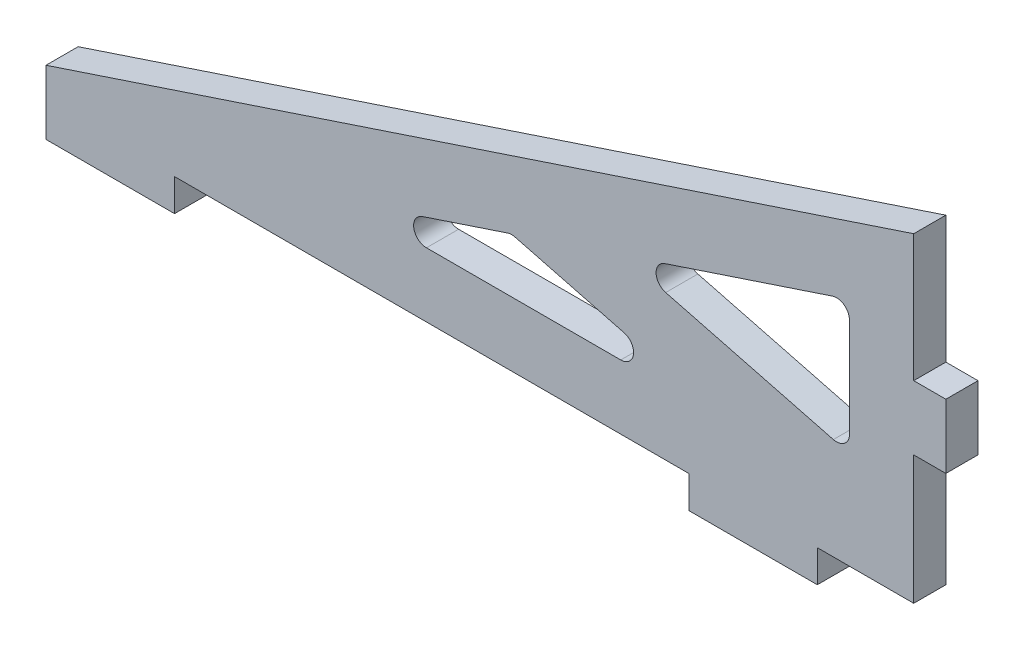
ISO-10303-21;
HEADER;
FILE_DESCRIPTION(('STEP AP214'),'2;1');
FILE_NAME('part.step','',(''),(''),'','','');
FILE_SCHEMA(('AUTOMOTIVE_DESIGN { 1 0 10303 214 1 1 1 1 }'));
ENDSEC;
DATA;
#1=APPLICATION_CONTEXT('core data for automotive mechanical design processes');
#2=APPLICATION_PROTOCOL_DEFINITION('international standard','automotive_design',2000,#1);
#3=PRODUCT_CONTEXT('',#1,'mechanical');
#4=PRODUCT('Part','Part','',(#3));
#5=PRODUCT_RELATED_PRODUCT_CATEGORY('part','',(#4));
#6=PRODUCT_DEFINITION_FORMATION('','',#4);
#7=PRODUCT_DEFINITION_CONTEXT('part definition',#1,'design');
#8=PRODUCT_DEFINITION('design','',#6,#7);
#9=PRODUCT_DEFINITION_SHAPE('','',#8);
#10=(LENGTH_UNIT() NAMED_UNIT(*) SI_UNIT(.MILLI.,.METRE.));
#11=(NAMED_UNIT(*) PLANE_ANGLE_UNIT() SI_UNIT($,.RADIAN.));
#12=(NAMED_UNIT(*) SI_UNIT($,.STERADIAN.) SOLID_ANGLE_UNIT());
#13=UNCERTAINTY_MEASURE_WITH_UNIT(LENGTH_MEASURE(1.E-05),#10,'distance_accuracy_value','');
#14=(GEOMETRIC_REPRESENTATION_CONTEXT(3) GLOBAL_UNCERTAINTY_ASSIGNED_CONTEXT((#13)) GLOBAL_UNIT_ASSIGNED_CONTEXT((#10,
#11,#12)) REPRESENTATION_CONTEXT('',''));
#15=CARTESIAN_POINT('',(0.,0.,0.));
#16=DIRECTION('',(0.,0.,1.));
#17=DIRECTION('',(1.,0.,0.));
#18=AXIS2_PLACEMENT_3D('',#15,#16,#17);
#19=CARTESIAN_POINT('',(0.,0.,6.35));
#20=DIRECTION('',(0.,0.,-1.));
#21=DIRECTION('',(-1.,0.,0.));
#22=AXIS2_PLACEMENT_3D('',#19,#20,#21);
#23=PLANE('',#22);
#24=DIRECTION('',(-0.967951190363356,0.251138394265319,0.));
#25=VECTOR('',#24,1.);
#26=CARTESIAN_POINT('',(40.1510767436975,154.752452894055,6.35));
#27=LINE('',#26,#25);
#28=CARTESIAN_POINT('',(21.2492621559513,159.656596214015,6.35));
#29=VERTEX_POINT('',#28);
#30=CARTESIAN_POINT('',(-0.29343059760243,165.245924808412,6.35));
#31=VERTEX_POINT('',#30);
#32=EDGE_CURVE('E360',#29,#31,#27,.T.);
#33=ORIENTED_EDGE('',*,*,#32,.F.);
#34=CARTESIAN_POINT('',(20.6113706345174,157.198000190492,6.35));
#35=DIRECTION('',(0.,0.,-1.));
#36=DIRECTION('',(-1.,0.,0.));
#37=AXIS2_PLACEMENT_3D('',#34,#35,#36);
#38=CIRCLE('',#37,2.54);
#39=CARTESIAN_POINT('',(20.6113706345174,154.658000190492,6.35));
#40=VERTEX_POINT('',#39);
#41=EDGE_CURVE('E305',#29,#40,#38,.T.);
#42=ORIENTED_EDGE('',*,*,#41,.T.);
#43=DIRECTION('',(-1.,0.,0.));
#44=VECTOR('',#43,1.);
#45=CARTESIAN_POINT('',(0.,154.658000190492,6.35));
#46=LINE('',#45,#44);
#47=CARTESIAN_POINT('',(-17.7741649816168,154.658000190492,6.35));
#48=VERTEX_POINT('',#47);
#49=EDGE_CURVE('E341',#40,#48,#46,.T.);
#50=ORIENTED_EDGE('',*,*,#49,.T.);
#51=CARTESIAN_POINT('',(-17.7741649816168,157.198000190492,6.35));
#52=DIRECTION('',(0.,0.,-1.));
#53=DIRECTION('',(-1.,0.,0.));
#54=AXIS2_PLACEMENT_3D('',#51,#52,#53);
#55=CIRCLE('',#54,2.54);
#56=CARTESIAN_POINT('',(-18.5741684928714,159.608725056996,6.35));
#57=VERTEX_POINT('',#56);
#58=EDGE_CURVE('E309',#48,#57,#55,.T.);
#59=ORIENTED_EDGE('',*,*,#58,.T.);
#60=DIRECTION('',(0.949104278151143,0.314962012304972,0.));
#61=VECTOR('',#60,1.);
#62=CARTESIAN_POINT('',(-49.5546997869046,149.327778375717,6.35));
#63=LINE('',#62,#61);
#64=CARTESIAN_POINT('',(-1.73132563029093,165.198053651393,6.35));
#65=VERTEX_POINT('',#64);
#66=EDGE_CURVE('E352',#57,#65,#63,.T.);
#67=ORIENTED_EDGE('',*,*,#66,.T.);
#68=CARTESIAN_POINT('',(-0.931322119036321,162.787328784889,6.35));
#69=DIRECTION('',(0.,0.,-1.));
#70=DIRECTION('',(-1.,0.,0.));
#71=AXIS2_PLACEMENT_3D('',#68,#69,#70);
#72=CIRCLE('',#71,2.54);
#73=EDGE_CURVE('E301',#65,#31,#72,.T.);
#74=ORIENTED_EDGE('',*,*,#73,.T.);
#75=EDGE_LOOP('',(#33,#42,#50,#59,#67,#74));
#76=FACE_BOUND('',#75,.T.);
#77=DIRECTION('',(0.,1.,0.));
#78=VECTOR('',#77,1.);
#79=CARTESIAN_POINT('',(78.4999848912985,180.058000190492,6.35));
#80=LINE('',#79,#78);
#81=CARTESIAN_POINT('',(78.4999848912985,180.058000190492,6.35));
#82=VERTEX_POINT('',#81);
#83=CARTESIAN_POINT('',(78.4999848912985,205.204000190492,6.35));
#84=VERTEX_POINT('',#83);
#85=EDGE_CURVE('E245',#82,#84,#80,.T.);
#86=ORIENTED_EDGE('',*,*,#85,.T.);
#87=DIRECTION('',(-0.949104278151143,-0.314962012304972,0.));
#88=VECTOR('',#87,1.);
#89=CARTESIAN_POINT('',(-92.9500151087015,148.308000190492,6.35));
#90=LINE('',#89,#88);
#91=CARTESIAN_POINT('',(-92.9500151087015,148.308000190492,6.35));
#92=VERTEX_POINT('',#91);
#93=EDGE_CURVE('E233',#84,#92,#90,.T.);
#94=ORIENTED_EDGE('',*,*,#93,.T.);
#95=DIRECTION('',(0.,-1.,0.));
#96=VECTOR('',#95,1.);
#97=CARTESIAN_POINT('',(-92.9500151087015,141.958000190492,6.35));
#98=LINE('',#97,#96);
#99=CARTESIAN_POINT('',(-92.9500151087015,135.608000190492,6.35));
#100=VERTEX_POINT('',#99);
#101=EDGE_CURVE('E244',#92,#100,#98,.T.);
#102=ORIENTED_EDGE('',*,*,#101,.T.);
#103=DIRECTION('',(1.,0.,0.));
#104=VECTOR('',#103,1.);
#105=CARTESIAN_POINT('',(-92.9500151087015,135.608000190492,6.35));
#106=LINE('',#105,#104);
#107=CARTESIAN_POINT('',(-67.5500151087015,135.608000190492,6.35));
#108=VERTEX_POINT('',#107);
#109=EDGE_CURVE('E366',#100,#108,#106,.T.);
#110=ORIENTED_EDGE('',*,*,#109,.T.);
#111=DIRECTION('',(0.,1.,0.));
#112=VECTOR('',#111,1.);
#113=CARTESIAN_POINT('',(-67.5500151087015,141.958000190492,6.35));
#114=LINE('',#113,#112);
#115=CARTESIAN_POINT('',(-67.5500151087015,141.958000190492,6.35));
#116=VERTEX_POINT('',#115);
#117=EDGE_CURVE('E368',#108,#116,#114,.T.);
#118=ORIENTED_EDGE('',*,*,#117,.T.);
#119=DIRECTION('',(1.,0.,0.));
#120=VECTOR('',#119,1.);
#121=CARTESIAN_POINT('',(-67.5500151087015,141.958000190492,6.35));
#122=LINE('',#121,#120);
#123=CARTESIAN_POINT('',(34.0499848912985,141.958000190492,6.35));
#124=VERTEX_POINT('',#123);
#125=EDGE_CURVE('E370',#116,#124,#122,.T.);
#126=ORIENTED_EDGE('',*,*,#125,.T.);
#127=DIRECTION('',(0.,-1.,0.));
#128=VECTOR('',#127,1.);
#129=CARTESIAN_POINT('',(34.0499848912985,135.608000190492,6.35));
#130=LINE('',#129,#128);
#131=CARTESIAN_POINT('',(34.0499848912985,135.608000190492,6.35));
#132=VERTEX_POINT('',#131);
#133=EDGE_CURVE('E372',#124,#132,#130,.T.);
#134=ORIENTED_EDGE('',*,*,#133,.T.);
#135=DIRECTION('',(1.,0.,0.));
#136=VECTOR('',#135,1.);
#137=CARTESIAN_POINT('',(34.0499848912985,135.608000190492,6.35));
#138=LINE('',#137,#136);
#139=CARTESIAN_POINT('',(59.4499848912985,135.608000190492,6.35));
#140=VERTEX_POINT('',#139);
#141=EDGE_CURVE('E374',#132,#140,#138,.T.);
#142=ORIENTED_EDGE('',*,*,#141,.T.);
#143=DIRECTION('',(0.,1.,0.));
#144=VECTOR('',#143,1.);
#145=CARTESIAN_POINT('',(59.4499848912985,141.958000190492,6.35));
#146=LINE('',#145,#144);
#147=CARTESIAN_POINT('',(59.4499848912985,141.958000190492,6.35));
#148=VERTEX_POINT('',#147);
#149=EDGE_CURVE('E376',#140,#148,#146,.T.);
#150=ORIENTED_EDGE('',*,*,#149,.T.);
#151=DIRECTION('',(1.,0.,0.));
#152=VECTOR('',#151,1.);
#153=CARTESIAN_POINT('',(59.4499848912985,141.958000190492,6.35));
#154=LINE('',#153,#152);
#155=CARTESIAN_POINT('',(78.4999848912985,141.958000190492,6.35));
#156=VERTEX_POINT('',#155);
#157=EDGE_CURVE('E378',#148,#156,#154,.T.);
#158=ORIENTED_EDGE('',*,*,#157,.T.);
#159=DIRECTION('',(0.,1.,0.));
#160=VECTOR('',#159,1.);
#161=CARTESIAN_POINT('',(78.4999848912985,167.358000190492,6.35));
#162=LINE('',#161,#160);
#163=CARTESIAN_POINT('',(78.4999848912985,167.358000190492,6.35));
#164=VERTEX_POINT('',#163);
#165=EDGE_CURVE('E380',#156,#164,#162,.T.);
#166=ORIENTED_EDGE('',*,*,#165,.T.);
#167=DIRECTION('',(1.,0.,0.));
#168=VECTOR('',#167,1.);
#169=CARTESIAN_POINT('',(84.8499848912985,167.358000190492,6.35));
#170=LINE('',#169,#168);
#171=CARTESIAN_POINT('',(84.8499848912985,167.358000190492,6.35));
#172=VERTEX_POINT('',#171);
#173=EDGE_CURVE('E382',#164,#172,#170,.T.);
#174=ORIENTED_EDGE('',*,*,#173,.T.);
#175=DIRECTION('',(0.,1.,0.));
#176=VECTOR('',#175,1.);
#177=CARTESIAN_POINT('',(84.8499848912985,167.358000190492,6.35));
#178=LINE('',#177,#176);
#179=CARTESIAN_POINT('',(84.8499848912985,180.058000190492,6.35));
#180=VERTEX_POINT('',#179);
#181=EDGE_CURVE('E384',#172,#180,#178,.T.);
#182=ORIENTED_EDGE('',*,*,#181,.T.);
#183=DIRECTION('',(-1.,0.,0.));
#184=VECTOR('',#183,1.);
#185=CARTESIAN_POINT('',(84.8499848912985,180.058000190492,6.35));
#186=LINE('',#185,#184);
#187=EDGE_CURVE('E250',#180,#82,#186,.T.);
#188=ORIENTED_EDGE('',*,*,#187,.T.);
#189=EDGE_LOOP('',(#86,#94,#102,#110,#118,#126,#134,#142,#150,#158,#166,#174,#182,#188));
#190=FACE_BOUND('',#189,.T.);
#191=DIRECTION('',(0.,-1.,0.));
#192=VECTOR('',#191,1.);
#193=CARTESIAN_POINT('',(65.7999848912985,0.,6.35));
#194=LINE('',#193,#192);
#195=CARTESIAN_POINT('',(65.7999848912985,184.089332889059,6.35));
#196=VERTEX_POINT('',#195);
#197=CARTESIAN_POINT('',(65.7999848912985,164.50135966594,6.35));
#198=VERTEX_POINT('',#197);
#199=EDGE_CURVE('E316',#196,#198,#194,.T.);
#200=ORIENTED_EDGE('',*,*,#199,.T.);
#201=CARTESIAN_POINT('',(63.2599848912985,164.50135966594,6.35));
#202=DIRECTION('',(0.,0.,-1.));
#203=DIRECTION('',(-1.,0.,0.));
#204=AXIS2_PLACEMENT_3D('',#201,#202,#203);
#205=CIRCLE('',#204,2.54);
#206=CARTESIAN_POINT('',(62.6220933698646,162.042763642417,6.35));
#207=VERTEX_POINT('',#206);
#208=EDGE_CURVE('E67',#198,#207,#205,.T.);
#209=ORIENTED_EDGE('',*,*,#208,.T.);
#210=DIRECTION('',(-0.967951190363356,0.251138394265319,0.));
#211=VECTOR('',#210,1.);
#212=CARTESIAN_POINT('',(43.3405343508671,167.04543301167,6.35));
#213=LINE('',#212,#211);
#214=CARTESIAN_POINT('',(29.4954342540084,170.637593692275,6.35));
#215=VERTEX_POINT('',#214);
#216=EDGE_CURVE('E314',#207,#215,#213,.T.);
#217=ORIENTED_EDGE('',*,*,#216,.T.);
#218=CARTESIAN_POINT('',(30.1333257754423,173.096189715798,6.35));
#219=DIRECTION('',(0.,0.,-1.));
#220=DIRECTION('',(-1.,0.,0.));
#221=AXIS2_PLACEMENT_3D('',#218,#219,#220);
#222=CIRCLE('',#221,2.54);
#223=CARTESIAN_POINT('',(29.3333222641877,175.506914582301,6.35));
#224=VERTEX_POINT('',#223);
#225=EDGE_CURVE('E297',#215,#224,#222,.T.);
#226=ORIENTED_EDGE('',*,*,#225,.T.);
#227=DIRECTION('',(0.949104278151143,0.314962012304972,0.));
#228=VECTOR('',#227,1.);
#229=CARTESIAN_POINT('',(-49.5546997869046,149.327778375717,6.35));
#230=LINE('',#229,#228);
#231=CARTESIAN_POINT('',(62.4599813800439,186.500057755563,6.35));
#232=VERTEX_POINT('',#231);
#233=EDGE_CURVE('E343',#224,#232,#230,.T.);
#234=ORIENTED_EDGE('',*,*,#233,.T.);
#235=CARTESIAN_POINT('',(63.2599848912985,184.089332889059,6.35));
#236=DIRECTION('',(0.,0.,-1.));
#237=DIRECTION('',(-1.,0.,0.));
#238=AXIS2_PLACEMENT_3D('',#235,#236,#237);
#239=CIRCLE('',#238,2.54);
#240=EDGE_CURVE('E293',#232,#196,#239,.T.);
#241=ORIENTED_EDGE('',*,*,#240,.T.);
#242=EDGE_LOOP('',(#200,#209,#217,#226,#234,#241));
#243=FACE_BOUND('',#242,.T.);
#244=ADVANCED_FACE('F59',(#76,#190,#243),#23,.F.);
#245=CARTESIAN_POINT('',(0.,0.,0.));
#246=DIRECTION('',(0.,0.,-1.));
#247=DIRECTION('',(-1.,0.,0.));
#248=AXIS2_PLACEMENT_3D('',#245,#246,#247);
#249=PLANE('',#248);
#250=DIRECTION('',(0.,1.,0.));
#251=VECTOR('',#250,1.);
#252=CARTESIAN_POINT('',(78.4999848912985,180.058000190492,0.));
#253=LINE('',#252,#251);
#254=CARTESIAN_POINT('',(78.4999848912985,180.058000190492,0.));
#255=VERTEX_POINT('',#254);
#256=CARTESIAN_POINT('',(78.4999848912985,205.204000190492,0.));
#257=VERTEX_POINT('',#256);
#258=EDGE_CURVE('E258',#255,#257,#253,.T.);
#259=ORIENTED_EDGE('',*,*,#258,.F.);
#260=DIRECTION('',(-1.,0.,0.));
#261=VECTOR('',#260,1.);
#262=CARTESIAN_POINT('',(84.8499848912985,180.058000190492,0.));
#263=LINE('',#262,#261);
#264=CARTESIAN_POINT('',(84.8499848912985,180.058000190492,0.));
#265=VERTEX_POINT('',#264);
#266=EDGE_CURVE('E254',#265,#255,#263,.T.);
#267=ORIENTED_EDGE('',*,*,#266,.F.);
#268=DIRECTION('',(0.,1.,0.));
#269=VECTOR('',#268,1.);
#270=CARTESIAN_POINT('',(84.8499848912985,167.358000190492,0.));
#271=LINE('',#270,#269);
#272=CARTESIAN_POINT('',(84.8499848912985,167.358000190492,0.));
#273=VERTEX_POINT('',#272);
#274=EDGE_CURVE('E411',#273,#265,#271,.T.);
#275=ORIENTED_EDGE('',*,*,#274,.F.);
#276=DIRECTION('',(1.,0.,0.));
#277=VECTOR('',#276,1.);
#278=CARTESIAN_POINT('',(84.8499848912985,167.358000190492,0.));
#279=LINE('',#278,#277);
#280=CARTESIAN_POINT('',(78.4999848912985,167.358000190492,0.));
#281=VERTEX_POINT('',#280);
#282=EDGE_CURVE('E409',#281,#273,#279,.T.);
#283=ORIENTED_EDGE('',*,*,#282,.F.);
#284=DIRECTION('',(0.,1.,0.));
#285=VECTOR('',#284,1.);
#286=CARTESIAN_POINT('',(78.4999848912985,167.358000190492,0.));
#287=LINE('',#286,#285);
#288=CARTESIAN_POINT('',(78.4999848912985,141.958000190492,0.));
#289=VERTEX_POINT('',#288);
#290=EDGE_CURVE('E407',#289,#281,#287,.T.);
#291=ORIENTED_EDGE('',*,*,#290,.F.);
#292=DIRECTION('',(1.,0.,0.));
#293=VECTOR('',#292,1.);
#294=CARTESIAN_POINT('',(59.4499848912985,141.958000190492,0.));
#295=LINE('',#294,#293);
#296=CARTESIAN_POINT('',(59.4499848912985,141.958000190492,0.));
#297=VERTEX_POINT('',#296);
#298=EDGE_CURVE('E405',#297,#289,#295,.T.);
#299=ORIENTED_EDGE('',*,*,#298,.F.);
#300=DIRECTION('',(0.,1.,0.));
#301=VECTOR('',#300,1.);
#302=CARTESIAN_POINT('',(59.4499848912985,141.958000190492,0.));
#303=LINE('',#302,#301);
#304=CARTESIAN_POINT('',(59.4499848912985,135.608000190492,0.));
#305=VERTEX_POINT('',#304);
#306=EDGE_CURVE('E403',#305,#297,#303,.T.);
#307=ORIENTED_EDGE('',*,*,#306,.F.);
#308=DIRECTION('',(1.,0.,0.));
#309=VECTOR('',#308,1.);
#310=CARTESIAN_POINT('',(34.0499848912985,135.608000190492,0.));
#311=LINE('',#310,#309);
#312=CARTESIAN_POINT('',(34.0499848912985,135.608000190492,0.));
#313=VERTEX_POINT('',#312);
#314=EDGE_CURVE('E401',#313,#305,#311,.T.);
#315=ORIENTED_EDGE('',*,*,#314,.F.);
#316=DIRECTION('',(0.,-1.,0.));
#317=VECTOR('',#316,1.);
#318=CARTESIAN_POINT('',(34.0499848912985,135.608000190492,0.));
#319=LINE('',#318,#317);
#320=CARTESIAN_POINT('',(34.0499848912985,141.958000190492,0.));
#321=VERTEX_POINT('',#320);
#322=EDGE_CURVE('E399',#321,#313,#319,.T.);
#323=ORIENTED_EDGE('',*,*,#322,.F.);
#324=DIRECTION('',(1.,0.,0.));
#325=VECTOR('',#324,1.);
#326=CARTESIAN_POINT('',(-67.5500151087015,141.958000190492,0.));
#327=LINE('',#326,#325);
#328=CARTESIAN_POINT('',(-67.5500151087015,141.958000190492,0.));
#329=VERTEX_POINT('',#328);
#330=EDGE_CURVE('E397',#329,#321,#327,.T.);
#331=ORIENTED_EDGE('',*,*,#330,.F.);
#332=DIRECTION('',(0.,1.,0.));
#333=VECTOR('',#332,1.);
#334=CARTESIAN_POINT('',(-67.5500151087015,141.958000190492,0.));
#335=LINE('',#334,#333);
#336=CARTESIAN_POINT('',(-67.5500151087015,135.608000190492,0.));
#337=VERTEX_POINT('',#336);
#338=EDGE_CURVE('E395',#337,#329,#335,.T.);
#339=ORIENTED_EDGE('',*,*,#338,.F.);
#340=DIRECTION('',(1.,0.,0.));
#341=VECTOR('',#340,1.);
#342=CARTESIAN_POINT('',(-92.9500151087015,135.608000190492,0.));
#343=LINE('',#342,#341);
#344=CARTESIAN_POINT('',(-92.9500151087015,135.608000190492,0.));
#345=VERTEX_POINT('',#344);
#346=EDGE_CURVE('E393',#345,#337,#343,.T.);
#347=ORIENTED_EDGE('',*,*,#346,.F.);
#348=DIRECTION('',(0.,-1.,0.));
#349=VECTOR('',#348,1.);
#350=CARTESIAN_POINT('',(-92.9500151087015,141.958000190492,0.));
#351=LINE('',#350,#349);
#352=CARTESIAN_POINT('',(-92.9500151087015,148.308000190492,0.));
#353=VERTEX_POINT('',#352);
#354=EDGE_CURVE('E391',#353,#345,#351,.T.);
#355=ORIENTED_EDGE('',*,*,#354,.F.);
#356=DIRECTION('',(-0.949104278151143,-0.314962012304972,0.));
#357=VECTOR('',#356,1.);
#358=CARTESIAN_POINT('',(-92.9500151087015,148.308000190492,0.));
#359=LINE('',#358,#357);
#360=EDGE_CURVE('E389',#257,#353,#359,.T.);
#361=ORIENTED_EDGE('',*,*,#360,.F.);
#362=EDGE_LOOP('',(#259,#267,#275,#283,#291,#299,#307,#315,#323,#331,#339,#347,#355,#361));
#363=FACE_BOUND('',#362,.T.);
#364=DIRECTION('',(0.949104278151143,0.314962012304972,0.));
#365=VECTOR('',#364,1.);
#366=CARTESIAN_POINT('',(-49.5546997869046,149.327778375717,0.));
#367=LINE('',#366,#365);
#368=CARTESIAN_POINT('',(-18.5741684928714,159.608725056996,0.));
#369=VERTEX_POINT('',#368);
#370=CARTESIAN_POINT('',(-1.73132563029093,165.198053651393,0.));
#371=VERTEX_POINT('',#370);
#372=EDGE_CURVE('E355',#369,#371,#367,.T.);
#373=ORIENTED_EDGE('',*,*,#372,.F.);
#374=CARTESIAN_POINT('',(-17.7741649816168,157.198000190492,0.));
#375=DIRECTION('',(0.,0.,-1.));
#376=DIRECTION('',(-1.,0.,0.));
#377=AXIS2_PLACEMENT_3D('',#374,#375,#376);
#378=CIRCLE('',#377,2.54);
#379=CARTESIAN_POINT('',(-17.7741649816168,154.658000190492,0.));
#380=VERTEX_POINT('',#379);
#381=EDGE_CURVE('E74',#369,#380,#378,.F.);
#382=ORIENTED_EDGE('',*,*,#381,.T.);
#383=DIRECTION('',(-1.,0.,0.));
#384=VECTOR('',#383,1.);
#385=CARTESIAN_POINT('',(0.,154.658000190492,0.));
#386=LINE('',#385,#384);
#387=CARTESIAN_POINT('',(20.6113706345174,154.658000190492,0.));
#388=VERTEX_POINT('',#387);
#389=EDGE_CURVE('E349',#388,#380,#386,.T.);
#390=ORIENTED_EDGE('',*,*,#389,.F.);
#391=CARTESIAN_POINT('',(20.6113706345174,157.198000190492,0.));
#392=DIRECTION('',(0.,0.,-1.));
#393=DIRECTION('',(-1.,0.,0.));
#394=AXIS2_PLACEMENT_3D('',#391,#392,#393);
#395=CIRCLE('',#394,2.54);
#396=CARTESIAN_POINT('',(21.2492621559513,159.656596214015,0.));
#397=VERTEX_POINT('',#396);
#398=EDGE_CURVE('E307',#388,#397,#395,.F.);
#399=ORIENTED_EDGE('',*,*,#398,.T.);
#400=DIRECTION('',(-0.967951190363356,0.251138394265319,0.));
#401=VECTOR('',#400,1.);
#402=CARTESIAN_POINT('',(40.1510767436975,154.752452894055,0.));
#403=LINE('',#402,#401);
#404=CARTESIAN_POINT('',(-0.29343059760243,165.245924808412,0.));
#405=VERTEX_POINT('',#404);
#406=EDGE_CURVE('E351',#397,#405,#403,.T.);
#407=ORIENTED_EDGE('',*,*,#406,.T.);
#408=CARTESIAN_POINT('',(-0.931322119036321,162.787328784889,0.));
#409=DIRECTION('',(0.,0.,-1.));
#410=DIRECTION('',(-1.,0.,0.));
#411=AXIS2_PLACEMENT_3D('',#408,#409,#410);
#412=CIRCLE('',#411,2.54);
#413=EDGE_CURVE('E303',#405,#371,#412,.F.);
#414=ORIENTED_EDGE('',*,*,#413,.T.);
#415=EDGE_LOOP('',(#373,#382,#390,#399,#407,#414));
#416=FACE_BOUND('',#415,.T.);
#417=DIRECTION('',(0.949104278151143,0.314962012304972,0.));
#418=VECTOR('',#417,1.);
#419=CARTESIAN_POINT('',(-49.5546997869046,149.327778375717,0.));
#420=LINE('',#419,#418);
#421=CARTESIAN_POINT('',(29.3333222641877,175.506914582301,0.));
#422=VERTEX_POINT('',#421);
#423=CARTESIAN_POINT('',(62.4599813800439,186.500057755563,0.));
#424=VERTEX_POINT('',#423);
#425=EDGE_CURVE('E338',#422,#424,#420,.T.);
#426=ORIENTED_EDGE('',*,*,#425,.F.);
#427=CARTESIAN_POINT('',(30.1333257754423,173.096189715798,0.));
#428=DIRECTION('',(0.,0.,-1.));
#429=DIRECTION('',(-1.,0.,0.));
#430=AXIS2_PLACEMENT_3D('',#427,#428,#429);
#431=CIRCLE('',#430,2.54);
#432=CARTESIAN_POINT('',(29.4954342540084,170.637593692275,0.));
#433=VERTEX_POINT('',#432);
#434=EDGE_CURVE('E299',#422,#433,#431,.F.);
#435=ORIENTED_EDGE('',*,*,#434,.T.);
#436=DIRECTION('',(-0.967951190363356,0.251138394265319,0.));
#437=VECTOR('',#436,1.);
#438=CARTESIAN_POINT('',(43.3405343508671,167.04543301167,0.));
#439=LINE('',#438,#437);
#440=CARTESIAN_POINT('',(62.6220933698646,162.042763642417,0.));
#441=VERTEX_POINT('',#440);
#442=EDGE_CURVE('E334',#441,#433,#439,.T.);
#443=ORIENTED_EDGE('',*,*,#442,.F.);
#444=CARTESIAN_POINT('',(63.2599848912985,164.50135966594,0.));
#445=DIRECTION('',(0.,0.,-1.));
#446=DIRECTION('',(-1.,0.,0.));
#447=AXIS2_PLACEMENT_3D('',#444,#445,#446);
#448=CIRCLE('',#447,2.54);
#449=CARTESIAN_POINT('',(65.7999848912985,164.50135966594,0.));
#450=VERTEX_POINT('',#449);
#451=EDGE_CURVE('E12',#441,#450,#448,.F.);
#452=ORIENTED_EDGE('',*,*,#451,.T.);
#453=DIRECTION('',(0.,-1.,0.));
#454=VECTOR('',#453,1.);
#455=CARTESIAN_POINT('',(65.7999848912985,0.,0.));
#456=LINE('',#455,#454);
#457=CARTESIAN_POINT('',(65.7999848912985,184.089332889059,0.));
#458=VERTEX_POINT('',#457);
#459=EDGE_CURVE('E332',#458,#450,#456,.T.);
#460=ORIENTED_EDGE('',*,*,#459,.F.);
#461=CARTESIAN_POINT('',(63.2599848912985,184.089332889059,0.));
#462=DIRECTION('',(0.,0.,-1.));
#463=DIRECTION('',(-1.,0.,0.));
#464=AXIS2_PLACEMENT_3D('',#461,#462,#463);
#465=CIRCLE('',#464,2.54);
#466=EDGE_CURVE('E295',#458,#424,#465,.F.);
#467=ORIENTED_EDGE('',*,*,#466,.T.);
#468=EDGE_LOOP('',(#426,#435,#443,#452,#460,#467));
#469=FACE_BOUND('',#468,.T.);
#470=ADVANCED_FACE('F331',(#363,#416,#469),#249,.T.);
#471=CARTESIAN_POINT('',(78.4999848912985,180.058000190492,6.35));
#472=DIRECTION('',(-1.,0.,0.));
#473=DIRECTION('',(0.,0.,1.));
#474=AXIS2_PLACEMENT_3D('',#471,#472,#473);
#475=PLANE('',#474);
#476=ORIENTED_EDGE('',*,*,#258,.T.);
#477=DIRECTION('',(0.,0.,-1.));
#478=VECTOR('',#477,1.);
#479=CARTESIAN_POINT('',(78.4999848912985,205.204000190492,6.35));
#480=LINE('',#479,#478);
#481=EDGE_CURVE('E238',#84,#257,#480,.T.);
#482=ORIENTED_EDGE('',*,*,#481,.F.);
#483=ORIENTED_EDGE('',*,*,#85,.F.);
#484=DIRECTION('',(0.,0.,-1.));
#485=VECTOR('',#484,1.);
#486=CARTESIAN_POINT('',(78.4999848912985,180.058000190492,6.35));
#487=LINE('',#486,#485);
#488=EDGE_CURVE('E387',#82,#255,#487,.T.);
#489=ORIENTED_EDGE('',*,*,#488,.T.);
#490=EDGE_LOOP('',(#476,#482,#483,#489));
#491=FACE_BOUND('',#490,.T.);
#492=ADVANCED_FACE('F256',(#491),#475,.F.);
#493=CARTESIAN_POINT('',(-92.9500151087015,148.308000190492,6.35));
#494=DIRECTION('',(0.314962012304972,-0.949104278151143,0.));
#495=DIRECTION('',(0.949104278151143,0.314962012304972,0.));
#496=AXIS2_PLACEMENT_3D('',#493,#494,#495);
#497=PLANE('',#496);
#498=ORIENTED_EDGE('',*,*,#360,.T.);
#499=DIRECTION('',(0.,0.,-1.));
#500=VECTOR('',#499,1.);
#501=CARTESIAN_POINT('',(-92.9500151087015,148.308000190492,6.35));
#502=LINE('',#501,#500);
#503=EDGE_CURVE('E241',#92,#353,#502,.T.);
#504=ORIENTED_EDGE('',*,*,#503,.F.);
#505=ORIENTED_EDGE('',*,*,#93,.F.);
#506=ORIENTED_EDGE('',*,*,#481,.T.);
#507=EDGE_LOOP('',(#498,#504,#505,#506));
#508=FACE_BOUND('',#507,.T.);
#509=ADVANCED_FACE('F236',(#508),#497,.F.);
#510=CARTESIAN_POINT('',(-92.9500151087015,141.958000190492,6.35));
#511=DIRECTION('',(1.,0.,0.));
#512=DIRECTION('',(0.,0.,-1.));
#513=AXIS2_PLACEMENT_3D('',#510,#511,#512);
#514=PLANE('',#513);
#515=ORIENTED_EDGE('',*,*,#354,.T.);
#516=DIRECTION('',(0.,0.,-1.));
#517=VECTOR('',#516,1.);
#518=CARTESIAN_POINT('',(-92.9500151087015,135.608000190492,6.35));
#519=LINE('',#518,#517);
#520=EDGE_CURVE('E263',#100,#345,#519,.T.);
#521=ORIENTED_EDGE('',*,*,#520,.F.);
#522=ORIENTED_EDGE('',*,*,#101,.F.);
#523=ORIENTED_EDGE('',*,*,#503,.T.);
#524=EDGE_LOOP('',(#515,#521,#522,#523));
#525=FACE_BOUND('',#524,.T.);
#526=ADVANCED_FACE('F466',(#525),#514,.F.);
#527=CARTESIAN_POINT('',(-92.9500151087015,135.608000190492,6.35));
#528=DIRECTION('',(0.,1.,0.));
#529=DIRECTION('',(0.,0.,1.));
#530=AXIS2_PLACEMENT_3D('',#527,#528,#529);
#531=PLANE('',#530);
#532=ORIENTED_EDGE('',*,*,#346,.T.);
#533=DIRECTION('',(0.,0.,-1.));
#534=VECTOR('',#533,1.);
#535=CARTESIAN_POINT('',(-67.5500151087015,135.608000190492,6.35));
#536=LINE('',#535,#534);
#537=EDGE_CURVE('E442',#108,#337,#536,.T.);
#538=ORIENTED_EDGE('',*,*,#537,.F.);
#539=ORIENTED_EDGE('',*,*,#109,.F.);
#540=ORIENTED_EDGE('',*,*,#520,.T.);
#541=EDGE_LOOP('',(#532,#538,#539,#540));
#542=FACE_BOUND('',#541,.T.);
#543=ADVANCED_FACE('F449',(#542),#531,.F.);
#544=CARTESIAN_POINT('',(-67.5500151087015,141.958000190492,6.35));
#545=DIRECTION('',(-1.,0.,0.));
#546=DIRECTION('',(0.,0.,1.));
#547=AXIS2_PLACEMENT_3D('',#544,#545,#546);
#548=PLANE('',#547);
#549=ORIENTED_EDGE('',*,*,#338,.T.);
#550=DIRECTION('',(0.,0.,-1.));
#551=VECTOR('',#550,1.);
#552=CARTESIAN_POINT('',(-67.5500151087015,141.958000190492,6.35));
#553=LINE('',#552,#551);
#554=EDGE_CURVE('E439',#116,#329,#553,.T.);
#555=ORIENTED_EDGE('',*,*,#554,.F.);
#556=ORIENTED_EDGE('',*,*,#117,.F.);
#557=ORIENTED_EDGE('',*,*,#537,.T.);
#558=EDGE_LOOP('',(#549,#555,#556,#557));
#559=FACE_BOUND('',#558,.T.);
#560=ADVANCED_FACE('F458',(#559),#548,.F.);
#561=CARTESIAN_POINT('',(-67.5500151087015,141.958000190492,6.35));
#562=DIRECTION('',(0.,1.,0.));
#563=DIRECTION('',(0.,0.,1.));
#564=AXIS2_PLACEMENT_3D('',#561,#562,#563);
#565=PLANE('',#564);
#566=ORIENTED_EDGE('',*,*,#330,.T.);
#567=DIRECTION('',(0.,0.,-1.));
#568=VECTOR('',#567,1.);
#569=CARTESIAN_POINT('',(34.0499848912985,141.958000190492,6.35));
#570=LINE('',#569,#568);
#571=EDGE_CURVE('E436',#124,#321,#570,.T.);
#572=ORIENTED_EDGE('',*,*,#571,.F.);
#573=ORIENTED_EDGE('',*,*,#125,.F.);
#574=ORIENTED_EDGE('',*,*,#554,.T.);
#575=EDGE_LOOP('',(#566,#572,#573,#574));
#576=FACE_BOUND('',#575,.T.);
#577=ADVANCED_FACE('F462',(#576),#565,.F.);
#578=CARTESIAN_POINT('',(34.0499848912985,135.608000190492,6.35));
#579=DIRECTION('',(1.,0.,0.));
#580=DIRECTION('',(0.,0.,-1.));
#581=AXIS2_PLACEMENT_3D('',#578,#579,#580);
#582=PLANE('',#581);
#583=ORIENTED_EDGE('',*,*,#322,.T.);
#584=DIRECTION('',(0.,0.,-1.));
#585=VECTOR('',#584,1.);
#586=CARTESIAN_POINT('',(34.0499848912985,135.608000190492,6.35));
#587=LINE('',#586,#585);
#588=EDGE_CURVE('E433',#132,#313,#587,.T.);
#589=ORIENTED_EDGE('',*,*,#588,.F.);
#590=ORIENTED_EDGE('',*,*,#133,.F.);
#591=ORIENTED_EDGE('',*,*,#571,.T.);
#592=EDGE_LOOP('',(#583,#589,#590,#591));
#593=FACE_BOUND('',#592,.T.);
#594=ADVANCED_FACE('F514',(#593),#582,.F.);
#595=CARTESIAN_POINT('',(34.0499848912985,135.608000190492,6.35));
#596=DIRECTION('',(0.,1.,0.));
#597=DIRECTION('',(0.,0.,1.));
#598=AXIS2_PLACEMENT_3D('',#595,#596,#597);
#599=PLANE('',#598);
#600=ORIENTED_EDGE('',*,*,#314,.T.);
#601=DIRECTION('',(0.,0.,-1.));
#602=VECTOR('',#601,1.);
#603=CARTESIAN_POINT('',(59.4499848912985,135.608000190492,6.35));
#604=LINE('',#603,#602);
#605=EDGE_CURVE('E430',#140,#305,#604,.T.);
#606=ORIENTED_EDGE('',*,*,#605,.F.);
#607=ORIENTED_EDGE('',*,*,#141,.F.);
#608=ORIENTED_EDGE('',*,*,#588,.T.);
#609=EDGE_LOOP('',(#600,#606,#607,#608));
#610=FACE_BOUND('',#609,.T.);
#611=ADVANCED_FACE('F510',(#610),#599,.F.);
#612=CARTESIAN_POINT('',(59.4499848912985,141.958000190492,6.35));
#613=DIRECTION('',(-1.,0.,0.));
#614=DIRECTION('',(0.,0.,1.));
#615=AXIS2_PLACEMENT_3D('',#612,#613,#614);
#616=PLANE('',#615);
#617=ORIENTED_EDGE('',*,*,#306,.T.);
#618=DIRECTION('',(0.,0.,-1.));
#619=VECTOR('',#618,1.);
#620=CARTESIAN_POINT('',(59.4499848912985,141.958000190492,6.35));
#621=LINE('',#620,#619);
#622=EDGE_CURVE('E427',#148,#297,#621,.T.);
#623=ORIENTED_EDGE('',*,*,#622,.F.);
#624=ORIENTED_EDGE('',*,*,#149,.F.);
#625=ORIENTED_EDGE('',*,*,#605,.T.);
#626=EDGE_LOOP('',(#617,#623,#624,#625));
#627=FACE_BOUND('',#626,.T.);
#628=ADVANCED_FACE('F506',(#627),#616,.F.);
#629=CARTESIAN_POINT('',(59.4499848912985,141.958000190492,6.35));
#630=DIRECTION('',(0.,1.,0.));
#631=DIRECTION('',(0.,0.,1.));
#632=AXIS2_PLACEMENT_3D('',#629,#630,#631);
#633=PLANE('',#632);
#634=ORIENTED_EDGE('',*,*,#298,.T.);
#635=DIRECTION('',(0.,0.,-1.));
#636=VECTOR('',#635,1.);
#637=CARTESIAN_POINT('',(78.4999848912985,141.958000190492,6.35));
#638=LINE('',#637,#636);
#639=EDGE_CURVE('E424',#156,#289,#638,.T.);
#640=ORIENTED_EDGE('',*,*,#639,.F.);
#641=ORIENTED_EDGE('',*,*,#157,.F.);
#642=ORIENTED_EDGE('',*,*,#622,.T.);
#643=EDGE_LOOP('',(#634,#640,#641,#642));
#644=FACE_BOUND('',#643,.T.);
#645=ADVANCED_FACE('F502',(#644),#633,.F.);
#646=CARTESIAN_POINT('',(78.4999848912985,167.358000190492,6.35));
#647=DIRECTION('',(-1.,0.,0.));
#648=DIRECTION('',(0.,-1.,0.));
#649=AXIS2_PLACEMENT_3D('',#646,#647,#648);
#650=PLANE('',#649);
#651=ORIENTED_EDGE('',*,*,#290,.T.);
#652=DIRECTION('',(0.,0.,-1.));
#653=VECTOR('',#652,1.);
#654=CARTESIAN_POINT('',(78.4999848912985,167.358000190492,6.35));
#655=LINE('',#654,#653);
#656=EDGE_CURVE('E421',#164,#281,#655,.T.);
#657=ORIENTED_EDGE('',*,*,#656,.F.);
#658=ORIENTED_EDGE('',*,*,#165,.F.);
#659=ORIENTED_EDGE('',*,*,#639,.T.);
#660=EDGE_LOOP('',(#651,#657,#658,#659));
#661=FACE_BOUND('',#660,.T.);
#662=ADVANCED_FACE('F498',(#661),#650,.F.);
#663=CARTESIAN_POINT('',(84.8499848912985,167.358000190492,6.35));
#664=DIRECTION('',(0.,1.,0.));
#665=DIRECTION('',(0.,0.,1.));
#666=AXIS2_PLACEMENT_3D('',#663,#664,#665);
#667=PLANE('',#666);
#668=ORIENTED_EDGE('',*,*,#282,.T.);
#669=DIRECTION('',(0.,0.,-1.));
#670=VECTOR('',#669,1.);
#671=CARTESIAN_POINT('',(84.8499848912985,167.358000190492,6.35));
#672=LINE('',#671,#670);
#673=EDGE_CURVE('E418',#172,#273,#672,.T.);
#674=ORIENTED_EDGE('',*,*,#673,.F.);
#675=ORIENTED_EDGE('',*,*,#173,.F.);
#676=ORIENTED_EDGE('',*,*,#656,.T.);
#677=EDGE_LOOP('',(#668,#674,#675,#676));
#678=FACE_BOUND('',#677,.T.);
#679=ADVANCED_FACE('F494',(#678),#667,.F.);
#680=CARTESIAN_POINT('',(84.8499848912985,167.358000190492,6.35));
#681=DIRECTION('',(-1.,0.,0.));
#682=DIRECTION('',(0.,-1.,0.));
#683=AXIS2_PLACEMENT_3D('',#680,#681,#682);
#684=PLANE('',#683);
#685=ORIENTED_EDGE('',*,*,#274,.T.);
#686=DIRECTION('',(0.,0.,-1.));
#687=VECTOR('',#686,1.);
#688=CARTESIAN_POINT('',(84.8499848912985,180.058000190492,6.35));
#689=LINE('',#688,#687);
#690=EDGE_CURVE('E415',#180,#265,#689,.T.);
#691=ORIENTED_EDGE('',*,*,#690,.F.);
#692=ORIENTED_EDGE('',*,*,#181,.F.);
#693=ORIENTED_EDGE('',*,*,#673,.T.);
#694=EDGE_LOOP('',(#685,#691,#692,#693));
#695=FACE_BOUND('',#694,.T.);
#696=ADVANCED_FACE('F490',(#695),#684,.F.);
#697=CARTESIAN_POINT('',(84.8499848912985,180.058000190492,6.35));
#698=DIRECTION('',(0.,-1.,0.));
#699=DIRECTION('',(0.,0.,-1.));
#700=AXIS2_PLACEMENT_3D('',#697,#698,#699);
#701=PLANE('',#700);
#702=ORIENTED_EDGE('',*,*,#266,.T.);
#703=ORIENTED_EDGE('',*,*,#488,.F.);
#704=ORIENTED_EDGE('',*,*,#187,.F.);
#705=ORIENTED_EDGE('',*,*,#690,.T.);
#706=EDGE_LOOP('',(#702,#703,#704,#705));
#707=FACE_BOUND('',#706,.T.);
#708=ADVANCED_FACE('F488',(#707),#701,.F.);
#709=CARTESIAN_POINT('',(0.,154.658000190492,0.));
#710=DIRECTION('',(0.,1.,0.));
#711=DIRECTION('',(0.,0.,1.));
#712=AXIS2_PLACEMENT_3D('',#709,#710,#711);
#713=PLANE('',#712);
#714=ORIENTED_EDGE('',*,*,#49,.F.);
#715=DIRECTION('',(0.,0.,1.));
#716=VECTOR('',#715,1.);
#717=CARTESIAN_POINT('',(20.6113706345174,154.658000190492,0.));
#718=LINE('',#717,#716);
#719=EDGE_CURVE('E81',#40,#388,#718,.F.);
#720=ORIENTED_EDGE('',*,*,#719,.T.);
#721=ORIENTED_EDGE('',*,*,#389,.T.);
#722=DIRECTION('',(0.,0.,1.));
#723=VECTOR('',#722,1.);
#724=CARTESIAN_POINT('',(-17.7741649816168,154.658000190492,6.35));
#725=LINE('',#724,#723);
#726=EDGE_CURVE('E289',#380,#48,#725,.T.);
#727=ORIENTED_EDGE('',*,*,#726,.T.);
#728=EDGE_LOOP('',(#714,#720,#721,#727));
#729=FACE_BOUND('',#728,.T.);
#730=ADVANCED_FACE('F485',(#729),#713,.T.);
#731=CARTESIAN_POINT('',(-49.5546997869046,149.327778375717,0.));
#732=DIRECTION('',(0.314962012304972,-0.949104278151143,0.));
#733=DIRECTION('',(0.949104278151143,0.314962012304972,0.));
#734=AXIS2_PLACEMENT_3D('',#731,#732,#733);
#735=PLANE('',#734);
#736=ORIENTED_EDGE('',*,*,#372,.T.);
#737=DIRECTION('',(0.,0.,1.));
#738=VECTOR('',#737,1.);
#739=CARTESIAN_POINT('',(-1.73132563029095,165.198053651393,0.));
#740=LINE('',#739,#738);
#741=EDGE_CURVE('E281',#371,#65,#740,.T.);
#742=ORIENTED_EDGE('',*,*,#741,.T.);
#743=ORIENTED_EDGE('',*,*,#66,.F.);
#744=DIRECTION('',(0.,0.,1.));
#745=VECTOR('',#744,1.);
#746=CARTESIAN_POINT('',(-18.5741684928714,159.608725056996,0.));
#747=LINE('',#746,#745);
#748=EDGE_CURVE('E279',#57,#369,#747,.F.);
#749=ORIENTED_EDGE('',*,*,#748,.T.);
#750=EDGE_LOOP('',(#736,#742,#743,#749));
#751=FACE_BOUND('',#750,.T.);
#752=ADVANCED_FACE('F591',(#751),#735,.T.);
#753=CARTESIAN_POINT('',(40.1510767436975,154.752452894055,0.));
#754=DIRECTION('',(0.251138394265319,0.967951190363356,0.));
#755=DIRECTION('',(-0.967951190363356,0.251138394265319,0.));
#756=AXIS2_PLACEMENT_3D('',#753,#754,#755);
#757=PLANE('',#756);
#758=ORIENTED_EDGE('',*,*,#32,.T.);
#759=DIRECTION('',(0.,0.,1.));
#760=VECTOR('',#759,1.);
#761=CARTESIAN_POINT('',(-0.293430597602416,165.245924808412,0.));
#762=LINE('',#761,#760);
#763=EDGE_CURVE('E287',#31,#405,#762,.F.);
#764=ORIENTED_EDGE('',*,*,#763,.T.);
#765=ORIENTED_EDGE('',*,*,#406,.F.);
#766=DIRECTION('',(0.,0.,1.));
#767=VECTOR('',#766,1.);
#768=CARTESIAN_POINT('',(21.2492621559513,159.656596214015,0.));
#769=LINE('',#768,#767);
#770=EDGE_CURVE('E284',#397,#29,#769,.T.);
#771=ORIENTED_EDGE('',*,*,#770,.T.);
#772=EDGE_LOOP('',(#758,#764,#765,#771));
#773=FACE_BOUND('',#772,.T.);
#774=ADVANCED_FACE('F599',(#773),#757,.F.);
#775=CARTESIAN_POINT('',(43.3405343508671,167.04543301167,0.));
#776=DIRECTION('',(0.251138394265319,0.967951190363356,0.));
#777=DIRECTION('',(-0.967951190363356,0.251138394265319,0.));
#778=AXIS2_PLACEMENT_3D('',#775,#776,#777);
#779=PLANE('',#778);
#780=ORIENTED_EDGE('',*,*,#442,.T.);
#781=DIRECTION('',(0.,0.,1.));
#782=VECTOR('',#781,1.);
#783=CARTESIAN_POINT('',(29.4954342540084,170.637593692275,6.35));
#784=LINE('',#783,#782);
#785=EDGE_CURVE('E276',#433,#215,#784,.T.);
#786=ORIENTED_EDGE('',*,*,#785,.T.);
#787=ORIENTED_EDGE('',*,*,#216,.F.);
#788=DIRECTION('',(0.,0.,1.));
#789=VECTOR('',#788,1.);
#790=CARTESIAN_POINT('',(62.6220933698646,162.042763642417,0.));
#791=LINE('',#790,#789);
#792=EDGE_CURVE('E274',#207,#441,#791,.F.);
#793=ORIENTED_EDGE('',*,*,#792,.T.);
#794=EDGE_LOOP('',(#780,#786,#787,#793));
#795=FACE_BOUND('',#794,.T.);
#796=ADVANCED_FACE('F322',(#795),#779,.T.);
#797=CARTESIAN_POINT('',(-49.5546997869046,149.327778375717,0.));
#798=DIRECTION('',(0.314962012304972,-0.949104278151143,0.));
#799=DIRECTION('',(0.949104278151143,0.314962012304972,0.));
#800=AXIS2_PLACEMENT_3D('',#797,#798,#799);
#801=PLANE('',#800);
#802=ORIENTED_EDGE('',*,*,#425,.T.);
#803=DIRECTION('',(0.,0.,1.));
#804=VECTOR('',#803,1.);
#805=CARTESIAN_POINT('',(62.4599813800439,186.500057755563,6.35));
#806=LINE('',#805,#804);
#807=EDGE_CURVE('E261',#424,#232,#806,.T.);
#808=ORIENTED_EDGE('',*,*,#807,.T.);
#809=ORIENTED_EDGE('',*,*,#233,.F.);
#810=DIRECTION('',(0.,0.,1.));
#811=VECTOR('',#810,1.);
#812=CARTESIAN_POINT('',(29.3333222641876,175.506914582301,0.));
#813=LINE('',#812,#811);
#814=EDGE_CURVE('E259',#224,#422,#813,.F.);
#815=ORIENTED_EDGE('',*,*,#814,.T.);
#816=EDGE_LOOP('',(#802,#808,#809,#815));
#817=FACE_BOUND('',#816,.T.);
#818=ADVANCED_FACE('F617',(#817),#801,.T.);
#819=CARTESIAN_POINT('',(65.7999848912985,0.,0.));
#820=DIRECTION('',(-1.,0.,0.));
#821=DIRECTION('',(0.,0.,1.));
#822=AXIS2_PLACEMENT_3D('',#819,#820,#821);
#823=PLANE('',#822);
#824=ORIENTED_EDGE('',*,*,#199,.F.);
#825=DIRECTION('',(0.,0.,1.));
#826=VECTOR('',#825,1.);
#827=CARTESIAN_POINT('',(65.7999848912985,184.089332889059,0.));
#828=LINE('',#827,#826);
#829=EDGE_CURVE('E272',#196,#458,#828,.F.);
#830=ORIENTED_EDGE('',*,*,#829,.T.);
#831=ORIENTED_EDGE('',*,*,#459,.T.);
#832=DIRECTION('',(0.,0.,1.));
#833=VECTOR('',#832,1.);
#834=CARTESIAN_POINT('',(65.7999848912985,164.50135966594,6.35));
#835=LINE('',#834,#833);
#836=EDGE_CURVE('E269',#450,#198,#835,.T.);
#837=ORIENTED_EDGE('',*,*,#836,.T.);
#838=EDGE_LOOP('',(#824,#830,#831,#837));
#839=FACE_BOUND('',#838,.T.);
#840=ADVANCED_FACE('F336',(#839),#823,.T.);
#841=CARTESIAN_POINT('',(63.2599848912985,184.089332889059,0.));
#842=DIRECTION('',(0.,0.,-1.));
#843=DIRECTION('',(-1.,0.,0.));
#844=AXIS2_PLACEMENT_3D('',#841,#842,#843);
#845=CYLINDRICAL_SURFACE('',#844,2.54);
#846=ORIENTED_EDGE('',*,*,#466,.F.);
#847=ORIENTED_EDGE('',*,*,#829,.F.);
#848=ORIENTED_EDGE('',*,*,#240,.F.);
#849=ORIENTED_EDGE('',*,*,#807,.F.);
#850=EDGE_LOOP('',(#846,#847,#848,#849));
#851=FACE_BOUND('',#850,.T.);
#852=ADVANCED_FACE('F635',(#851),#845,.F.);
#853=CARTESIAN_POINT('',(30.1333257754423,173.096189715798,0.));
#854=DIRECTION('',(0.,0.,-1.));
#855=DIRECTION('',(-1.,0.,0.));
#856=AXIS2_PLACEMENT_3D('',#853,#854,#855);
#857=CYLINDRICAL_SURFACE('',#856,2.54);
#858=ORIENTED_EDGE('',*,*,#434,.F.);
#859=ORIENTED_EDGE('',*,*,#814,.F.);
#860=ORIENTED_EDGE('',*,*,#225,.F.);
#861=ORIENTED_EDGE('',*,*,#785,.F.);
#862=EDGE_LOOP('',(#858,#859,#860,#861));
#863=FACE_BOUND('',#862,.T.);
#864=ADVANCED_FACE('F644',(#863),#857,.F.);
#865=CARTESIAN_POINT('',(-0.931322119036321,162.787328784889,0.));
#866=DIRECTION('',(0.,0.,1.));
#867=DIRECTION('',(1.,0.,0.));
#868=AXIS2_PLACEMENT_3D('',#865,#866,#867);
#869=CYLINDRICAL_SURFACE('',#868,2.54);
#870=ORIENTED_EDGE('',*,*,#413,.F.);
#871=ORIENTED_EDGE('',*,*,#763,.F.);
#872=ORIENTED_EDGE('',*,*,#73,.F.);
#873=ORIENTED_EDGE('',*,*,#741,.F.);
#874=EDGE_LOOP('',(#870,#871,#872,#873));
#875=FACE_BOUND('',#874,.T.);
#876=ADVANCED_FACE('F654',(#875),#869,.F.);
#877=CARTESIAN_POINT('',(20.6113706345174,157.198000190492,0.));
#878=DIRECTION('',(0.,0.,1.));
#879=DIRECTION('',(1.,0.,0.));
#880=AXIS2_PLACEMENT_3D('',#877,#878,#879);
#881=CYLINDRICAL_SURFACE('',#880,2.54);
#882=ORIENTED_EDGE('',*,*,#398,.F.);
#883=ORIENTED_EDGE('',*,*,#719,.F.);
#884=ORIENTED_EDGE('',*,*,#41,.F.);
#885=ORIENTED_EDGE('',*,*,#770,.F.);
#886=EDGE_LOOP('',(#882,#883,#884,#885));
#887=FACE_BOUND('',#886,.T.);
#888=ADVANCED_FACE('F664',(#887),#881,.F.);
#889=CARTESIAN_POINT('',(-17.7741649816168,157.198000190492,0.));
#890=DIRECTION('',(0.,0.,-1.));
#891=DIRECTION('',(-1.,0.,0.));
#892=AXIS2_PLACEMENT_3D('',#889,#890,#891);
#893=CYLINDRICAL_SURFACE('',#892,2.54);
#894=ORIENTED_EDGE('',*,*,#381,.F.);
#895=ORIENTED_EDGE('',*,*,#748,.F.);
#896=ORIENTED_EDGE('',*,*,#58,.F.);
#897=ORIENTED_EDGE('',*,*,#726,.F.);
#898=EDGE_LOOP('',(#894,#895,#896,#897));
#899=FACE_BOUND('',#898,.T.);
#900=ADVANCED_FACE('F674',(#899),#893,.F.);
#901=CARTESIAN_POINT('',(63.2599848912985,164.50135966594,0.));
#902=DIRECTION('',(0.,0.,-1.));
#903=DIRECTION('',(-1.,0.,0.));
#904=AXIS2_PLACEMENT_3D('',#901,#902,#903);
#905=CYLINDRICAL_SURFACE('',#904,2.54);
#906=ORIENTED_EDGE('',*,*,#451,.F.);
#907=ORIENTED_EDGE('',*,*,#792,.F.);
#908=ORIENTED_EDGE('',*,*,#208,.F.);
#909=ORIENTED_EDGE('',*,*,#836,.F.);
#910=EDGE_LOOP('',(#906,#907,#908,#909));
#911=FACE_BOUND('',#910,.T.);
#912=ADVANCED_FACE('F61',(#911),#905,.F.);
#913=CLOSED_SHELL('',(#244,#470,#492,#509,#526,#543,#560,#577,#594,#611,#628,#645,#662,#679,
#696,#708,#730,#752,#774,#796,#818,#840,#852,#864,#876,#888,#900,#912));
#914=MANIFOLD_SOLID_BREP('B2',#913);
#915=ADVANCED_BREP_SHAPE_REPRESENTATION('',(#18,#914),#14);
#916=SHAPE_DEFINITION_REPRESENTATION(#9,#915);
ENDSEC;
END-ISO-10303-21;
